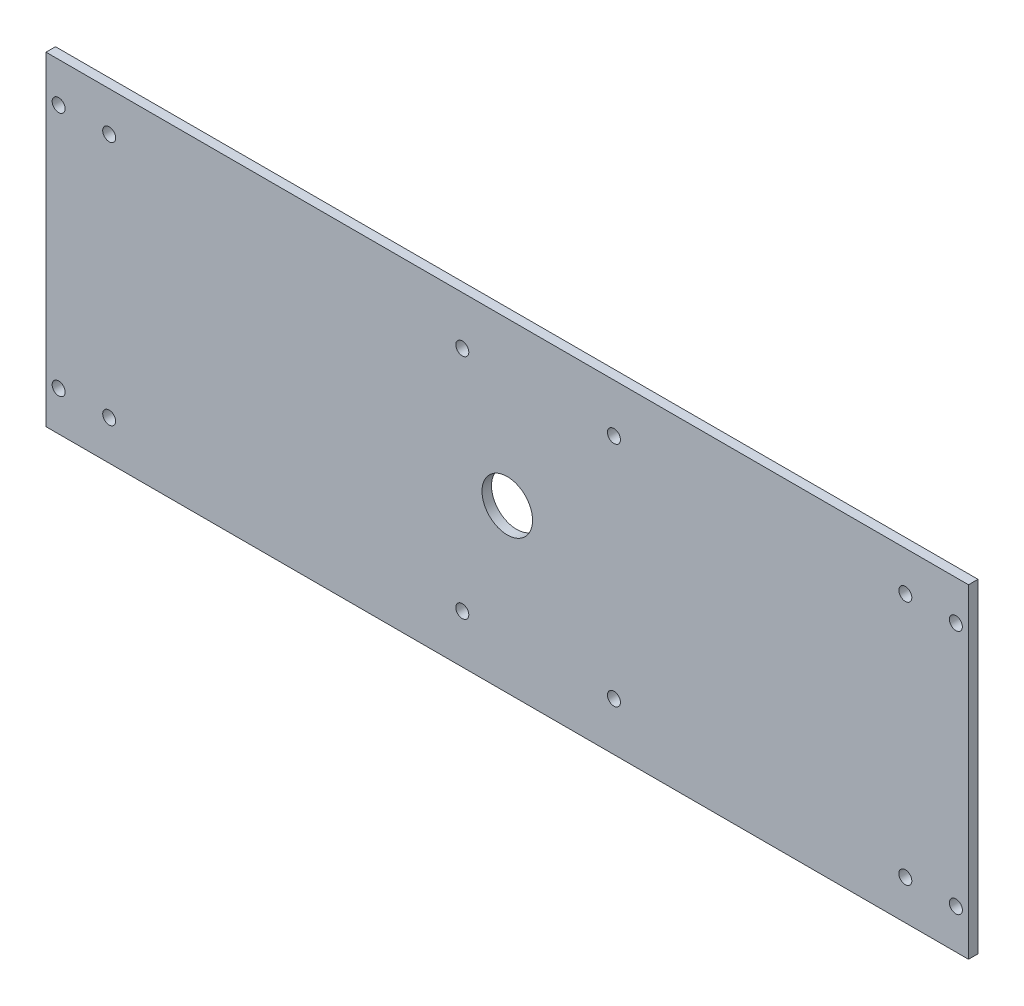
ISO-10303-21;
HEADER;
FILE_DESCRIPTION(('STEP AP214'),'2;1');
FILE_NAME('part.step','',(''),(''),'','','');
FILE_SCHEMA(('AUTOMOTIVE_DESIGN { 1 0 10303 214 1 1 1 1 }'));
ENDSEC;
DATA;
#1=APPLICATION_CONTEXT('core data for automotive mechanical design processes');
#2=APPLICATION_PROTOCOL_DEFINITION('international standard','automotive_design',2000,#1);
#3=PRODUCT_CONTEXT('',#1,'mechanical');
#4=PRODUCT('Part','Part','',(#3));
#5=PRODUCT_RELATED_PRODUCT_CATEGORY('part','',(#4));
#6=PRODUCT_DEFINITION_FORMATION('','',#4);
#7=PRODUCT_DEFINITION_CONTEXT('part definition',#1,'design');
#8=PRODUCT_DEFINITION('design','',#6,#7);
#9=PRODUCT_DEFINITION_SHAPE('','',#8);
#10=(LENGTH_UNIT() NAMED_UNIT(*) SI_UNIT(.MILLI.,.METRE.));
#11=(NAMED_UNIT(*) PLANE_ANGLE_UNIT() SI_UNIT($,.RADIAN.));
#12=(NAMED_UNIT(*) SI_UNIT($,.STERADIAN.) SOLID_ANGLE_UNIT());
#13=UNCERTAINTY_MEASURE_WITH_UNIT(LENGTH_MEASURE(1.E-05),#10,'distance_accuracy_value','');
#14=(GEOMETRIC_REPRESENTATION_CONTEXT(3) GLOBAL_UNCERTAINTY_ASSIGNED_CONTEXT((#13)) GLOBAL_UNIT_ASSIGNED_CONTEXT((#10,
#11,#12)) REPRESENTATION_CONTEXT('',''));
#15=CARTESIAN_POINT('',(0.,0.,0.));
#16=DIRECTION('',(0.,0.,1.));
#17=DIRECTION('',(1.,0.,0.));
#18=AXIS2_PLACEMENT_3D('',#15,#16,#17);
#19=CARTESIAN_POINT('',(0.,0.,2.38125));
#20=DIRECTION('',(0.,0.,-1.));
#21=DIRECTION('',(-1.,0.,0.));
#22=AXIS2_PLACEMENT_3D('',#19,#20,#21);
#23=PLANE('',#22);
#24=CARTESIAN_POINT('',(0.,0.,2.38125));
#25=DIRECTION('',(0.,0.,1.));
#26=DIRECTION('',(1.,0.,0.));
#27=AXIS2_PLACEMENT_3D('',#24,#25,#26);
#28=CIRCLE('',#27,6.34999999999999);
#29=CARTESIAN_POINT('',(6.34999999999999,0.,2.38125));
#30=VERTEX_POINT('',#29);
#31=EDGE_CURVE('E373',#30,#30,#28,.T.);
#32=ORIENTED_EDGE('',*,*,#31,.F.);
#33=EDGE_LOOP('',(#32));
#34=FACE_BOUND('',#33,.T.);
#35=CARTESIAN_POINT('',(-100.0125,-30.82036,2.38125));
#36=DIRECTION('',(0.,0.,1.));
#37=DIRECTION('',(1.,0.,0.));
#38=AXIS2_PLACEMENT_3D('',#35,#36,#37);
#39=CIRCLE('',#38,1.63194999999999);
#40=CARTESIAN_POINT('',(-98.38055,-30.82036,2.38125));
#41=VERTEX_POINT('',#40);
#42=EDGE_CURVE('E135',#41,#41,#39,.T.);
#43=ORIENTED_EDGE('',*,*,#42,.F.);
#44=EDGE_LOOP('',(#43));
#45=FACE_BOUND('',#44,.T.);
#46=CARTESIAN_POINT('',(100.0125,-30.82036,2.38125));
#47=DIRECTION('',(0.,0.,1.));
#48=DIRECTION('',(1.,0.,0.));
#49=AXIS2_PLACEMENT_3D('',#46,#47,#48);
#50=CIRCLE('',#49,1.63194999999999);
#51=CARTESIAN_POINT('',(101.64445,-30.82036,2.38125));
#52=VERTEX_POINT('',#51);
#53=EDGE_CURVE('E129',#52,#52,#50,.T.);
#54=ORIENTED_EDGE('',*,*,#53,.F.);
#55=EDGE_LOOP('',(#54));
#56=FACE_BOUND('',#55,.T.);
#57=CARTESIAN_POINT('',(112.7125,30.82036,2.38125));
#58=DIRECTION('',(0.,0.,1.));
#59=DIRECTION('',(1.,0.,0.));
#60=AXIS2_PLACEMENT_3D('',#57,#58,#59);
#61=CIRCLE('',#60,1.63194999999999);
#62=CARTESIAN_POINT('',(114.34445,30.82036,2.38125));
#63=VERTEX_POINT('',#62);
#64=EDGE_CURVE('E125',#63,#63,#61,.T.);
#65=ORIENTED_EDGE('',*,*,#64,.F.);
#66=EDGE_LOOP('',(#65));
#67=FACE_BOUND('',#66,.T.);
#68=CARTESIAN_POINT('',(100.0125,30.82036,2.38125));
#69=DIRECTION('',(0.,0.,1.));
#70=DIRECTION('',(1.,0.,0.));
#71=AXIS2_PLACEMENT_3D('',#68,#69,#70);
#72=CIRCLE('',#71,1.63194999999999);
#73=CARTESIAN_POINT('',(101.64445,30.82036,2.38125));
#74=VERTEX_POINT('',#73);
#75=EDGE_CURVE('E121',#74,#74,#72,.T.);
#76=ORIENTED_EDGE('',*,*,#75,.F.);
#77=EDGE_LOOP('',(#76));
#78=FACE_BOUND('',#77,.T.);
#79=CARTESIAN_POINT('',(-112.7125,30.82036,2.38125));
#80=DIRECTION('',(0.,0.,1.));
#81=DIRECTION('',(1.,0.,0.));
#82=AXIS2_PLACEMENT_3D('',#79,#80,#81);
#83=CIRCLE('',#82,1.63194999999999);
#84=CARTESIAN_POINT('',(-111.08055,30.82036,2.38125));
#85=VERTEX_POINT('',#84);
#86=EDGE_CURVE('E117',#85,#85,#83,.T.);
#87=ORIENTED_EDGE('',*,*,#86,.F.);
#88=EDGE_LOOP('',(#87));
#89=FACE_BOUND('',#88,.T.);
#90=CARTESIAN_POINT('',(-100.0125,30.82036,2.38125));
#91=DIRECTION('',(0.,0.,1.));
#92=DIRECTION('',(1.,0.,0.));
#93=AXIS2_PLACEMENT_3D('',#90,#91,#92);
#94=CIRCLE('',#93,1.63194999999999);
#95=CARTESIAN_POINT('',(-98.38055,30.82036,2.38125));
#96=VERTEX_POINT('',#95);
#97=EDGE_CURVE('E113',#96,#96,#94,.T.);
#98=ORIENTED_EDGE('',*,*,#97,.F.);
#99=EDGE_LOOP('',(#98));
#100=FACE_BOUND('',#99,.T.);
#101=CARTESIAN_POINT('',(-11.29792,-28.575,2.38125));
#102=DIRECTION('',(0.,0.,1.));
#103=DIRECTION('',(1.,0.,0.));
#104=AXIS2_PLACEMENT_3D('',#101,#102,#103);
#105=CIRCLE('',#104,1.63194999999999);
#106=CARTESIAN_POINT('',(-9.66597000000002,-28.575,2.38125));
#107=VERTEX_POINT('',#106);
#108=EDGE_CURVE('E112',#107,#107,#105,.T.);
#109=ORIENTED_EDGE('',*,*,#108,.F.);
#110=EDGE_LOOP('',(#109));
#111=FACE_BOUND('',#110,.T.);
#112=CARTESIAN_POINT('',(26.80208,-28.575,2.38125));
#113=DIRECTION('',(0.,0.,1.));
#114=DIRECTION('',(1.,0.,0.));
#115=AXIS2_PLACEMENT_3D('',#112,#113,#114);
#116=CIRCLE('',#115,1.63194999999999);
#117=CARTESIAN_POINT('',(28.43403,-28.575,2.38125));
#118=VERTEX_POINT('',#117);
#119=EDGE_CURVE('E164',#118,#118,#116,.T.);
#120=ORIENTED_EDGE('',*,*,#119,.F.);
#121=EDGE_LOOP('',(#120));
#122=FACE_BOUND('',#121,.T.);
#123=CARTESIAN_POINT('',(-11.29792,28.575,2.38125));
#124=DIRECTION('',(0.,0.,1.));
#125=DIRECTION('',(1.,0.,0.));
#126=AXIS2_PLACEMENT_3D('',#123,#124,#125);
#127=CIRCLE('',#126,1.63194999999999);
#128=CARTESIAN_POINT('',(-9.66597000000002,28.575,2.38125));
#129=VERTEX_POINT('',#128);
#130=EDGE_CURVE('E170',#129,#129,#127,.T.);
#131=ORIENTED_EDGE('',*,*,#130,.F.);
#132=EDGE_LOOP('',(#131));
#133=FACE_BOUND('',#132,.T.);
#134=CARTESIAN_POINT('',(26.80208,28.575,2.38125));
#135=DIRECTION('',(0.,0.,1.));
#136=DIRECTION('',(1.,0.,0.));
#137=AXIS2_PLACEMENT_3D('',#134,#135,#136);
#138=CIRCLE('',#137,1.63194999999999);
#139=CARTESIAN_POINT('',(28.43403,28.575,2.38125));
#140=VERTEX_POINT('',#139);
#141=EDGE_CURVE('E176',#140,#140,#138,.T.);
#142=ORIENTED_EDGE('',*,*,#141,.F.);
#143=EDGE_LOOP('',(#142));
#144=FACE_BOUND('',#143,.T.);
#145=DIRECTION('',(0.,1.,0.));
#146=VECTOR('',#145,1.);
#147=CARTESIAN_POINT('',(115.8875,-40.74795,2.38125));
#148=LINE('',#147,#146);
#149=CARTESIAN_POINT('',(115.8875,-40.74795,2.38125));
#150=VERTEX_POINT('',#149);
#151=CARTESIAN_POINT('',(115.8875,40.74795,2.38125));
#152=VERTEX_POINT('',#151);
#153=EDGE_CURVE('E87',#150,#152,#148,.T.);
#154=ORIENTED_EDGE('',*,*,#153,.T.);
#155=DIRECTION('',(-1.,0.,0.));
#156=VECTOR('',#155,1.);
#157=CARTESIAN_POINT('',(-115.8875,40.74795,2.38125));
#158=LINE('',#157,#156);
#159=CARTESIAN_POINT('',(-115.8875,40.74795,2.38125));
#160=VERTEX_POINT('',#159);
#161=EDGE_CURVE('E82',#152,#160,#158,.T.);
#162=ORIENTED_EDGE('',*,*,#161,.T.);
#163=DIRECTION('',(0.,-1.,0.));
#164=VECTOR('',#163,1.);
#165=CARTESIAN_POINT('',(-115.8875,-40.74795,2.38125));
#166=LINE('',#165,#164);
#167=CARTESIAN_POINT('',(-115.8875,-40.74795,2.38125));
#168=VERTEX_POINT('',#167);
#169=EDGE_CURVE('E85',#160,#168,#166,.T.);
#170=ORIENTED_EDGE('',*,*,#169,.T.);
#171=DIRECTION('',(1.,0.,0.));
#172=VECTOR('',#171,1.);
#173=CARTESIAN_POINT('',(-115.8875,-40.74795,2.38125));
#174=LINE('',#173,#172);
#175=EDGE_CURVE('E52',#168,#150,#174,.T.);
#176=ORIENTED_EDGE('',*,*,#175,.T.);
#177=EDGE_LOOP('',(#154,#162,#170,#176));
#178=FACE_BOUND('',#177,.T.);
#179=CARTESIAN_POINT('',(112.7125,-30.82036,2.38125));
#180=DIRECTION('',(0.,0.,1.));
#181=DIRECTION('',(1.,0.,0.));
#182=AXIS2_PLACEMENT_3D('',#179,#180,#181);
#183=CIRCLE('',#182,1.63194999999999);
#184=CARTESIAN_POINT('',(114.34445,-30.82036,2.38125));
#185=VERTEX_POINT('',#184);
#186=EDGE_CURVE('E132',#185,#185,#183,.T.);
#187=ORIENTED_EDGE('',*,*,#186,.F.);
#188=EDGE_LOOP('',(#187));
#189=FACE_BOUND('',#188,.T.);
#190=CARTESIAN_POINT('',(-112.7125,-30.82036,2.38125));
#191=DIRECTION('',(0.,0.,1.));
#192=DIRECTION('',(1.,0.,0.));
#193=AXIS2_PLACEMENT_3D('',#190,#191,#192);
#194=CIRCLE('',#193,1.63194999999999);
#195=CARTESIAN_POINT('',(-111.08055,-30.82036,2.38125));
#196=VERTEX_POINT('',#195);
#197=EDGE_CURVE('E145',#196,#196,#194,.T.);
#198=ORIENTED_EDGE('',*,*,#197,.F.);
#199=EDGE_LOOP('',(#198));
#200=FACE_BOUND('',#199,.T.);
#201=ADVANCED_FACE('F33',(#34,#45,#56,#67,#78,#89,#100,#111,#122,#133,#144,#178,#189,#200),#23,.F.);
#202=CARTESIAN_POINT('',(115.8875,-40.74795,2.38125));
#203=DIRECTION('',(-1.,0.,0.));
#204=DIRECTION('',(0.,0.,1.));
#205=AXIS2_PLACEMENT_3D('',#202,#203,#204);
#206=PLANE('',#205);
#207=DIRECTION('',(0.,1.,0.));
#208=VECTOR('',#207,1.);
#209=CARTESIAN_POINT('',(115.8875,-40.74795,0.));
#210=LINE('',#209,#208);
#211=CARTESIAN_POINT('',(115.8875,-40.74795,0.));
#212=VERTEX_POINT('',#211);
#213=CARTESIAN_POINT('',(115.8875,40.74795,0.));
#214=VERTEX_POINT('',#213);
#215=EDGE_CURVE('E100',#212,#214,#210,.T.);
#216=ORIENTED_EDGE('',*,*,#215,.T.);
#217=DIRECTION('',(0.,0.,-1.));
#218=VECTOR('',#217,1.);
#219=CARTESIAN_POINT('',(115.8875,40.74795,2.38125));
#220=LINE('',#219,#218);
#221=EDGE_CURVE('E11',#152,#214,#220,.T.);
#222=ORIENTED_EDGE('',*,*,#221,.F.);
#223=ORIENTED_EDGE('',*,*,#153,.F.);
#224=DIRECTION('',(0.,0.,-1.));
#225=VECTOR('',#224,1.);
#226=CARTESIAN_POINT('',(115.8875,-40.74795,2.38125));
#227=LINE('',#226,#225);
#228=EDGE_CURVE('E96',#150,#212,#227,.T.);
#229=ORIENTED_EDGE('',*,*,#228,.T.);
#230=EDGE_LOOP('',(#216,#222,#223,#229));
#231=FACE_BOUND('',#230,.T.);
#232=ADVANCED_FACE('F35',(#231),#206,.F.);
#233=CARTESIAN_POINT('',(-115.8875,40.74795,2.38125));
#234=DIRECTION('',(0.,-1.,0.));
#235=DIRECTION('',(0.,0.,-1.));
#236=AXIS2_PLACEMENT_3D('',#233,#234,#235);
#237=PLANE('',#236);
#238=DIRECTION('',(-1.,0.,0.));
#239=VECTOR('',#238,1.);
#240=CARTESIAN_POINT('',(-115.8875,40.74795,0.));
#241=LINE('',#240,#239);
#242=CARTESIAN_POINT('',(-115.8875,40.74795,0.));
#243=VERTEX_POINT('',#242);
#244=EDGE_CURVE('E91',#214,#243,#241,.T.);
#245=ORIENTED_EDGE('',*,*,#244,.T.);
#246=DIRECTION('',(0.,0.,-1.));
#247=VECTOR('',#246,1.);
#248=CARTESIAN_POINT('',(-115.8875,40.74795,2.38125));
#249=LINE('',#248,#247);
#250=EDGE_CURVE('E43',#160,#243,#249,.T.);
#251=ORIENTED_EDGE('',*,*,#250,.F.);
#252=ORIENTED_EDGE('',*,*,#161,.F.);
#253=ORIENTED_EDGE('',*,*,#221,.T.);
#254=EDGE_LOOP('',(#245,#251,#252,#253));
#255=FACE_BOUND('',#254,.T.);
#256=ADVANCED_FACE('F90',(#255),#237,.F.);
#257=CARTESIAN_POINT('',(-115.8875,-40.74795,2.38125));
#258=DIRECTION('',(1.,0.,0.));
#259=DIRECTION('',(0.,0.,-1.));
#260=AXIS2_PLACEMENT_3D('',#257,#258,#259);
#261=PLANE('',#260);
#262=DIRECTION('',(0.,-1.,0.));
#263=VECTOR('',#262,1.);
#264=CARTESIAN_POINT('',(-115.8875,-40.74795,0.));
#265=LINE('',#264,#263);
#266=CARTESIAN_POINT('',(-115.8875,-40.74795,0.));
#267=VERTEX_POINT('',#266);
#268=EDGE_CURVE('E69',#243,#267,#265,.T.);
#269=ORIENTED_EDGE('',*,*,#268,.T.);
#270=DIRECTION('',(0.,0.,-1.));
#271=VECTOR('',#270,1.);
#272=CARTESIAN_POINT('',(-115.8875,-40.74795,2.38125));
#273=LINE('',#272,#271);
#274=EDGE_CURVE('E92',#168,#267,#273,.T.);
#275=ORIENTED_EDGE('',*,*,#274,.F.);
#276=ORIENTED_EDGE('',*,*,#169,.F.);
#277=ORIENTED_EDGE('',*,*,#250,.T.);
#278=EDGE_LOOP('',(#269,#275,#276,#277));
#279=FACE_BOUND('',#278,.T.);
#280=ADVANCED_FACE('F94',(#279),#261,.F.);
#281=CARTESIAN_POINT('',(-115.8875,-40.74795,2.38125));
#282=DIRECTION('',(0.,1.,0.));
#283=DIRECTION('',(0.,0.,1.));
#284=AXIS2_PLACEMENT_3D('',#281,#282,#283);
#285=PLANE('',#284);
#286=DIRECTION('',(1.,0.,0.));
#287=VECTOR('',#286,1.);
#288=CARTESIAN_POINT('',(-115.8875,-40.74795,0.));
#289=LINE('',#288,#287);
#290=EDGE_CURVE('E75',#267,#212,#289,.T.);
#291=ORIENTED_EDGE('',*,*,#290,.T.);
#292=ORIENTED_EDGE('',*,*,#228,.F.);
#293=ORIENTED_EDGE('',*,*,#175,.F.);
#294=ORIENTED_EDGE('',*,*,#274,.T.);
#295=EDGE_LOOP('',(#291,#292,#293,#294));
#296=FACE_BOUND('',#295,.T.);
#297=ADVANCED_FACE('F205',(#296),#285,.F.);
#298=CARTESIAN_POINT('',(0.,0.,0.));
#299=DIRECTION('',(0.,0.,-1.));
#300=DIRECTION('',(-1.,0.,0.));
#301=AXIS2_PLACEMENT_3D('',#298,#299,#300);
#302=PLANE('',#301);
#303=CARTESIAN_POINT('',(0.,0.,0.));
#304=DIRECTION('',(0.,0.,1.));
#305=DIRECTION('',(1.,0.,0.));
#306=AXIS2_PLACEMENT_3D('',#303,#304,#305);
#307=CIRCLE('',#306,6.35);
#308=CARTESIAN_POINT('',(6.35,0.,0.));
#309=VERTEX_POINT('',#308);
#310=EDGE_CURVE('E371',#309,#309,#307,.T.);
#311=ORIENTED_EDGE('',*,*,#310,.T.);
#312=EDGE_LOOP('',(#311));
#313=FACE_BOUND('',#312,.T.);
#314=CARTESIAN_POINT('',(-112.7125,-30.82036,0.));
#315=DIRECTION('',(0.,0.,-1.));
#316=DIRECTION('',(-1.,0.,0.));
#317=AXIS2_PLACEMENT_3D('',#314,#315,#316);
#318=CIRCLE('',#317,1.63194999999999);
#319=CARTESIAN_POINT('',(-114.34445,-30.82036,0.));
#320=VERTEX_POINT('',#319);
#321=EDGE_CURVE('E37',#320,#320,#318,.T.);
#322=ORIENTED_EDGE('',*,*,#321,.F.);
#323=EDGE_LOOP('',(#322));
#324=FACE_BOUND('',#323,.T.);
#325=CARTESIAN_POINT('',(-100.0125,-30.82036,0.));
#326=DIRECTION('',(0.,0.,-1.));
#327=DIRECTION('',(-1.,0.,0.));
#328=AXIS2_PLACEMENT_3D('',#325,#326,#327);
#329=CIRCLE('',#328,1.63194999999999);
#330=CARTESIAN_POINT('',(-101.64445,-30.82036,0.));
#331=VERTEX_POINT('',#330);
#332=EDGE_CURVE('E133',#331,#331,#329,.T.);
#333=ORIENTED_EDGE('',*,*,#332,.F.);
#334=EDGE_LOOP('',(#333));
#335=FACE_BOUND('',#334,.T.);
#336=CARTESIAN_POINT('',(112.7125,-30.82036,0.));
#337=DIRECTION('',(0.,0.,-1.));
#338=DIRECTION('',(-1.,0.,0.));
#339=AXIS2_PLACEMENT_3D('',#336,#337,#338);
#340=CIRCLE('',#339,1.63194999999999);
#341=CARTESIAN_POINT('',(111.08055,-30.82036,0.));
#342=VERTEX_POINT('',#341);
#343=EDGE_CURVE('E130',#342,#342,#340,.T.);
#344=ORIENTED_EDGE('',*,*,#343,.F.);
#345=EDGE_LOOP('',(#344));
#346=FACE_BOUND('',#345,.T.);
#347=CARTESIAN_POINT('',(100.0125,-30.82036,0.));
#348=DIRECTION('',(0.,0.,-1.));
#349=DIRECTION('',(-1.,0.,0.));
#350=AXIS2_PLACEMENT_3D('',#347,#348,#349);
#351=CIRCLE('',#350,1.63194999999999);
#352=CARTESIAN_POINT('',(98.38055,-30.82036,0.));
#353=VERTEX_POINT('',#352);
#354=EDGE_CURVE('E126',#353,#353,#351,.T.);
#355=ORIENTED_EDGE('',*,*,#354,.F.);
#356=EDGE_LOOP('',(#355));
#357=FACE_BOUND('',#356,.T.);
#358=CARTESIAN_POINT('',(112.7125,30.82036,0.));
#359=DIRECTION('',(0.,0.,-1.));
#360=DIRECTION('',(-1.,0.,0.));
#361=AXIS2_PLACEMENT_3D('',#358,#359,#360);
#362=CIRCLE('',#361,1.63194999999999);
#363=CARTESIAN_POINT('',(111.08055,30.82036,0.));
#364=VERTEX_POINT('',#363);
#365=EDGE_CURVE('E122',#364,#364,#362,.T.);
#366=ORIENTED_EDGE('',*,*,#365,.F.);
#367=EDGE_LOOP('',(#366));
#368=FACE_BOUND('',#367,.T.);
#369=CARTESIAN_POINT('',(100.0125,30.82036,0.));
#370=DIRECTION('',(0.,0.,-1.));
#371=DIRECTION('',(-1.,0.,0.));
#372=AXIS2_PLACEMENT_3D('',#369,#370,#371);
#373=CIRCLE('',#372,1.63194999999999);
#374=CARTESIAN_POINT('',(98.38055,30.82036,0.));
#375=VERTEX_POINT('',#374);
#376=EDGE_CURVE('E118',#375,#375,#373,.T.);
#377=ORIENTED_EDGE('',*,*,#376,.F.);
#378=EDGE_LOOP('',(#377));
#379=FACE_BOUND('',#378,.T.);
#380=CARTESIAN_POINT('',(-112.7125,30.82036,0.));
#381=DIRECTION('',(0.,0.,-1.));
#382=DIRECTION('',(-1.,0.,0.));
#383=AXIS2_PLACEMENT_3D('',#380,#381,#382);
#384=CIRCLE('',#383,1.63194999999999);
#385=CARTESIAN_POINT('',(-114.34445,30.82036,0.));
#386=VERTEX_POINT('',#385);
#387=EDGE_CURVE('E114',#386,#386,#384,.T.);
#388=ORIENTED_EDGE('',*,*,#387,.F.);
#389=EDGE_LOOP('',(#388));
#390=FACE_BOUND('',#389,.T.);
#391=CARTESIAN_POINT('',(-100.0125,30.82036,0.));
#392=DIRECTION('',(0.,0.,-1.));
#393=DIRECTION('',(-1.,0.,0.));
#394=AXIS2_PLACEMENT_3D('',#391,#392,#393);
#395=CIRCLE('',#394,1.63194999999999);
#396=CARTESIAN_POINT('',(-101.64445,30.82036,0.));
#397=VERTEX_POINT('',#396);
#398=EDGE_CURVE('E109',#397,#397,#395,.T.);
#399=ORIENTED_EDGE('',*,*,#398,.F.);
#400=EDGE_LOOP('',(#399));
#401=FACE_BOUND('',#400,.T.);
#402=CARTESIAN_POINT('',(-11.29792,-28.575,0.));
#403=DIRECTION('',(0.,0.,1.));
#404=DIRECTION('',(1.,0.,0.));
#405=AXIS2_PLACEMENT_3D('',#402,#403,#404);
#406=CIRCLE('',#405,1.63195);
#407=CARTESIAN_POINT('',(-9.66597,-28.575,0.));
#408=VERTEX_POINT('',#407);
#409=EDGE_CURVE('E161',#408,#408,#406,.T.);
#410=ORIENTED_EDGE('',*,*,#409,.T.);
#411=EDGE_LOOP('',(#410));
#412=FACE_BOUND('',#411,.T.);
#413=CARTESIAN_POINT('',(26.80208,-28.575,0.));
#414=DIRECTION('',(0.,0.,1.));
#415=DIRECTION('',(1.,0.,0.));
#416=AXIS2_PLACEMENT_3D('',#413,#414,#415);
#417=CIRCLE('',#416,1.63195);
#418=CARTESIAN_POINT('',(28.43403,-28.575,0.));
#419=VERTEX_POINT('',#418);
#420=EDGE_CURVE('E167',#419,#419,#417,.T.);
#421=ORIENTED_EDGE('',*,*,#420,.T.);
#422=EDGE_LOOP('',(#421));
#423=FACE_BOUND('',#422,.T.);
#424=CARTESIAN_POINT('',(-11.29792,28.575,0.));
#425=DIRECTION('',(0.,0.,1.));
#426=DIRECTION('',(1.,0.,0.));
#427=AXIS2_PLACEMENT_3D('',#424,#425,#426);
#428=CIRCLE('',#427,1.63195);
#429=CARTESIAN_POINT('',(-9.66597,28.575,0.));
#430=VERTEX_POINT('',#429);
#431=EDGE_CURVE('E173',#430,#430,#428,.T.);
#432=ORIENTED_EDGE('',*,*,#431,.T.);
#433=EDGE_LOOP('',(#432));
#434=FACE_BOUND('',#433,.T.);
#435=CARTESIAN_POINT('',(26.80208,28.575,0.));
#436=DIRECTION('',(0.,0.,1.));
#437=DIRECTION('',(1.,0.,0.));
#438=AXIS2_PLACEMENT_3D('',#435,#436,#437);
#439=CIRCLE('',#438,1.63195);
#440=CARTESIAN_POINT('',(28.43403,28.575,0.));
#441=VERTEX_POINT('',#440);
#442=EDGE_CURVE('E103',#441,#441,#439,.T.);
#443=ORIENTED_EDGE('',*,*,#442,.T.);
#444=EDGE_LOOP('',(#443));
#445=FACE_BOUND('',#444,.T.);
#446=ORIENTED_EDGE('',*,*,#215,.F.);
#447=ORIENTED_EDGE('',*,*,#290,.F.);
#448=ORIENTED_EDGE('',*,*,#268,.F.);
#449=ORIENTED_EDGE('',*,*,#244,.F.);
#450=EDGE_LOOP('',(#446,#447,#448,#449));
#451=FACE_BOUND('',#450,.T.);
#452=ADVANCED_FACE('F182',(#313,#324,#335,#346,#357,#368,#379,#390,#401,#412,#423,#434,#445,
#451),#302,.T.);
#453=CARTESIAN_POINT('',(26.80208,28.575,2.38125));
#454=DIRECTION('',(0.,0.,1.));
#455=DIRECTION('',(1.,0.,0.));
#456=AXIS2_PLACEMENT_3D('',#453,#454,#455);
#457=CYLINDRICAL_SURFACE('',#456,1.63194999999999);
#458=ORIENTED_EDGE('',*,*,#442,.F.);
#459=EDGE_LOOP('',(#458));
#460=FACE_BOUND('',#459,.T.);
#461=ORIENTED_EDGE('',*,*,#141,.T.);
#462=EDGE_LOOP('',(#461));
#463=FACE_BOUND('',#462,.T.);
#464=ADVANCED_FACE('F185',(#460,#463),#457,.F.);
#465=CARTESIAN_POINT('',(-11.29792,28.575,2.38125));
#466=DIRECTION('',(0.,0.,1.));
#467=DIRECTION('',(1.,0.,0.));
#468=AXIS2_PLACEMENT_3D('',#465,#466,#467);
#469=CYLINDRICAL_SURFACE('',#468,1.63194999999999);
#470=ORIENTED_EDGE('',*,*,#431,.F.);
#471=EDGE_LOOP('',(#470));
#472=FACE_BOUND('',#471,.T.);
#473=ORIENTED_EDGE('',*,*,#130,.T.);
#474=EDGE_LOOP('',(#473));
#475=FACE_BOUND('',#474,.T.);
#476=ADVANCED_FACE('F188',(#472,#475),#469,.F.);
#477=CARTESIAN_POINT('',(26.80208,-28.575,2.38125));
#478=DIRECTION('',(0.,0.,1.));
#479=DIRECTION('',(1.,0.,0.));
#480=AXIS2_PLACEMENT_3D('',#477,#478,#479);
#481=CYLINDRICAL_SURFACE('',#480,1.63194999999999);
#482=ORIENTED_EDGE('',*,*,#420,.F.);
#483=EDGE_LOOP('',(#482));
#484=FACE_BOUND('',#483,.T.);
#485=ORIENTED_EDGE('',*,*,#119,.T.);
#486=EDGE_LOOP('',(#485));
#487=FACE_BOUND('',#486,.T.);
#488=ADVANCED_FACE('F238',(#484,#487),#481,.F.);
#489=CARTESIAN_POINT('',(-11.29792,-28.575,2.38125));
#490=DIRECTION('',(0.,0.,1.));
#491=DIRECTION('',(1.,0.,0.));
#492=AXIS2_PLACEMENT_3D('',#489,#490,#491);
#493=CYLINDRICAL_SURFACE('',#492,1.63194999999999);
#494=ORIENTED_EDGE('',*,*,#409,.F.);
#495=EDGE_LOOP('',(#494));
#496=FACE_BOUND('',#495,.T.);
#497=ORIENTED_EDGE('',*,*,#108,.T.);
#498=EDGE_LOOP('',(#497));
#499=FACE_BOUND('',#498,.T.);
#500=ADVANCED_FACE('F245',(#496,#499),#493,.F.);
#501=CARTESIAN_POINT('',(-100.0125,30.82036,2.38125));
#502=DIRECTION('',(0.,0.,1.));
#503=DIRECTION('',(1.,0.,0.));
#504=AXIS2_PLACEMENT_3D('',#501,#502,#503);
#505=CYLINDRICAL_SURFACE('',#504,1.63194999999999);
#506=ORIENTED_EDGE('',*,*,#398,.T.);
#507=EDGE_LOOP('',(#506));
#508=FACE_BOUND('',#507,.T.);
#509=ORIENTED_EDGE('',*,*,#97,.T.);
#510=EDGE_LOOP('',(#509));
#511=FACE_BOUND('',#510,.T.);
#512=ADVANCED_FACE('F253',(#508,#511),#505,.F.);
#513=CARTESIAN_POINT('',(-112.7125,30.82036,2.38125));
#514=DIRECTION('',(0.,0.,1.));
#515=DIRECTION('',(1.,0.,0.));
#516=AXIS2_PLACEMENT_3D('',#513,#514,#515);
#517=CYLINDRICAL_SURFACE('',#516,1.63194999999999);
#518=ORIENTED_EDGE('',*,*,#387,.T.);
#519=EDGE_LOOP('',(#518));
#520=FACE_BOUND('',#519,.T.);
#521=ORIENTED_EDGE('',*,*,#86,.T.);
#522=EDGE_LOOP('',(#521));
#523=FACE_BOUND('',#522,.T.);
#524=ADVANCED_FACE('F261',(#520,#523),#517,.F.);
#525=CARTESIAN_POINT('',(100.0125,30.82036,2.38125));
#526=DIRECTION('',(0.,0.,1.));
#527=DIRECTION('',(1.,0.,0.));
#528=AXIS2_PLACEMENT_3D('',#525,#526,#527);
#529=CYLINDRICAL_SURFACE('',#528,1.63194999999999);
#530=ORIENTED_EDGE('',*,*,#376,.T.);
#531=EDGE_LOOP('',(#530));
#532=FACE_BOUND('',#531,.T.);
#533=ORIENTED_EDGE('',*,*,#75,.T.);
#534=EDGE_LOOP('',(#533));
#535=FACE_BOUND('',#534,.T.);
#536=ADVANCED_FACE('F269',(#532,#535),#529,.F.);
#537=CARTESIAN_POINT('',(112.7125,30.82036,2.38125));
#538=DIRECTION('',(0.,0.,1.));
#539=DIRECTION('',(1.,0.,0.));
#540=AXIS2_PLACEMENT_3D('',#537,#538,#539);
#541=CYLINDRICAL_SURFACE('',#540,1.63194999999999);
#542=ORIENTED_EDGE('',*,*,#365,.T.);
#543=EDGE_LOOP('',(#542));
#544=FACE_BOUND('',#543,.T.);
#545=ORIENTED_EDGE('',*,*,#64,.T.);
#546=EDGE_LOOP('',(#545));
#547=FACE_BOUND('',#546,.T.);
#548=ADVANCED_FACE('F277',(#544,#547),#541,.F.);
#549=CARTESIAN_POINT('',(100.0125,-30.82036,2.38125));
#550=DIRECTION('',(0.,0.,1.));
#551=DIRECTION('',(1.,0.,0.));
#552=AXIS2_PLACEMENT_3D('',#549,#550,#551);
#553=CYLINDRICAL_SURFACE('',#552,1.63194999999999);
#554=ORIENTED_EDGE('',*,*,#354,.T.);
#555=EDGE_LOOP('',(#554));
#556=FACE_BOUND('',#555,.T.);
#557=ORIENTED_EDGE('',*,*,#53,.T.);
#558=EDGE_LOOP('',(#557));
#559=FACE_BOUND('',#558,.T.);
#560=ADVANCED_FACE('F285',(#556,#559),#553,.F.);
#561=CARTESIAN_POINT('',(112.7125,-30.82036,2.38125));
#562=DIRECTION('',(0.,0.,1.));
#563=DIRECTION('',(1.,0.,0.));
#564=AXIS2_PLACEMENT_3D('',#561,#562,#563);
#565=CYLINDRICAL_SURFACE('',#564,1.63194999999999);
#566=ORIENTED_EDGE('',*,*,#343,.T.);
#567=EDGE_LOOP('',(#566));
#568=FACE_BOUND('',#567,.T.);
#569=ORIENTED_EDGE('',*,*,#186,.T.);
#570=EDGE_LOOP('',(#569));
#571=FACE_BOUND('',#570,.T.);
#572=ADVANCED_FACE('F293',(#568,#571),#565,.F.);
#573=CARTESIAN_POINT('',(-100.0125,-30.82036,2.38125));
#574=DIRECTION('',(0.,0.,1.));
#575=DIRECTION('',(1.,0.,0.));
#576=AXIS2_PLACEMENT_3D('',#573,#574,#575);
#577=CYLINDRICAL_SURFACE('',#576,1.63194999999999);
#578=ORIENTED_EDGE('',*,*,#332,.T.);
#579=EDGE_LOOP('',(#578));
#580=FACE_BOUND('',#579,.T.);
#581=ORIENTED_EDGE('',*,*,#42,.T.);
#582=EDGE_LOOP('',(#581));
#583=FACE_BOUND('',#582,.T.);
#584=ADVANCED_FACE('F301',(#580,#583),#577,.F.);
#585=CARTESIAN_POINT('',(-112.7125,-30.82036,2.38125));
#586=DIRECTION('',(0.,0.,1.));
#587=DIRECTION('',(1.,0.,0.));
#588=AXIS2_PLACEMENT_3D('',#585,#586,#587);
#589=CYLINDRICAL_SURFACE('',#588,1.63194999999999);
#590=ORIENTED_EDGE('',*,*,#321,.T.);
#591=EDGE_LOOP('',(#590));
#592=FACE_BOUND('',#591,.T.);
#593=ORIENTED_EDGE('',*,*,#197,.T.);
#594=EDGE_LOOP('',(#593));
#595=FACE_BOUND('',#594,.T.);
#596=ADVANCED_FACE('F309',(#592,#595),#589,.F.);
#597=CARTESIAN_POINT('',(0.,0.,2.38125));
#598=DIRECTION('',(0.,0.,1.));
#599=DIRECTION('',(1.,0.,0.));
#600=AXIS2_PLACEMENT_3D('',#597,#598,#599);
#601=CYLINDRICAL_SURFACE('',#600,6.34999999999999);
#602=ORIENTED_EDGE('',*,*,#310,.F.);
#603=EDGE_LOOP('',(#602));
#604=FACE_BOUND('',#603,.T.);
#605=ORIENTED_EDGE('',*,*,#31,.T.);
#606=EDGE_LOOP('',(#605));
#607=FACE_BOUND('',#606,.T.);
#608=ADVANCED_FACE('F316',(#604,#607),#601,.F.);
#609=CLOSED_SHELL('',(#201,#232,#256,#280,#297,#452,#464,#476,#488,#500,#512,#524,#536,#548,
#560,#572,#584,#596,#608));
#610=MANIFOLD_SOLID_BREP('B2',#609);
#611=ADVANCED_BREP_SHAPE_REPRESENTATION('',(#18,#610),#14);
#612=SHAPE_DEFINITION_REPRESENTATION(#9,#611);
ENDSEC;
END-ISO-10303-21;
